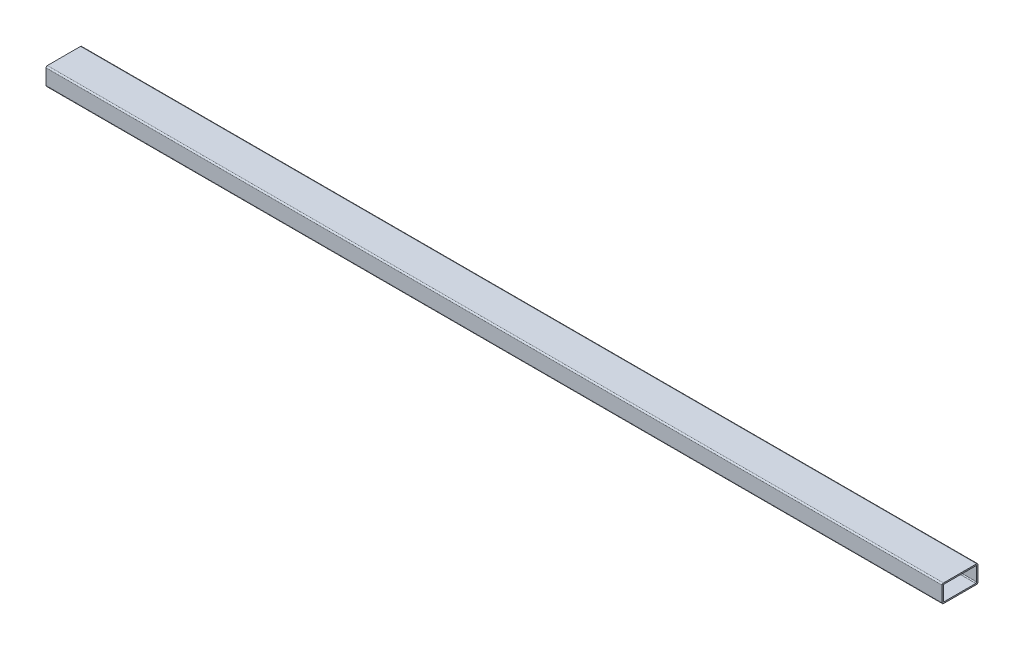
ISO-10303-21;
HEADER;
FILE_DESCRIPTION(('STEP AP214'),'2;1');
FILE_NAME('part.step','',(''),(''),'','','');
FILE_SCHEMA(('AUTOMOTIVE_DESIGN { 1 0 10303 214 1 1 1 1 }'));
ENDSEC;
DATA;
#1=APPLICATION_CONTEXT('core data for automotive mechanical design processes');
#2=APPLICATION_PROTOCOL_DEFINITION('international standard','automotive_design',2000,#1);
#3=PRODUCT_CONTEXT('',#1,'mechanical');
#4=PRODUCT('Part','Part','',(#3));
#5=PRODUCT_RELATED_PRODUCT_CATEGORY('part','',(#4));
#6=PRODUCT_DEFINITION_FORMATION('','',#4);
#7=PRODUCT_DEFINITION_CONTEXT('part definition',#1,'design');
#8=PRODUCT_DEFINITION('design','',#6,#7);
#9=PRODUCT_DEFINITION_SHAPE('','',#8);
#10=(LENGTH_UNIT() NAMED_UNIT(*) SI_UNIT(.MILLI.,.METRE.));
#11=(NAMED_UNIT(*) PLANE_ANGLE_UNIT() SI_UNIT($,.RADIAN.));
#12=(NAMED_UNIT(*) SI_UNIT($,.STERADIAN.) SOLID_ANGLE_UNIT());
#13=UNCERTAINTY_MEASURE_WITH_UNIT(LENGTH_MEASURE(1.E-05),#10,'distance_accuracy_value','');
#14=(GEOMETRIC_REPRESENTATION_CONTEXT(3) GLOBAL_UNCERTAINTY_ASSIGNED_CONTEXT((#13)) GLOBAL_UNIT_ASSIGNED_CONTEXT((#10,
#11,#12)) REPRESENTATION_CONTEXT('',''));
#15=CARTESIAN_POINT('',(0.,0.,0.));
#16=DIRECTION('',(0.,0.,1.));
#17=DIRECTION('',(1.,0.,0.));
#18=AXIS2_PLACEMENT_3D('',#15,#16,#17);
#19=CARTESIAN_POINT('',(-1000.,1.50000000000001,1.49999999999225));
#20=DIRECTION('',(1.,0.,0.));
#21=DIRECTION('',(0.,0.,-1.));
#22=AXIS2_PLACEMENT_3D('',#19,#20,#21);
#23=CYLINDRICAL_SURFACE('',#22,1.5);
#24=CARTESIAN_POINT('',(0.,1.50000000000001,1.49999999999225));
#25=DIRECTION('',(1.,0.,0.));
#26=DIRECTION('',(0.,0.,1.));
#27=AXIS2_PLACEMENT_3D('',#24,#25,#26);
#28=CIRCLE('',#27,1.5);
#29=CARTESIAN_POINT('',(0.,0.,1.49999999999225));
#30=VERTEX_POINT('',#29);
#31=CARTESIAN_POINT('',(0.,1.50000000000003,-7.75768338456828E-12));
#32=VERTEX_POINT('',#31);
#33=EDGE_CURVE('E205',#30,#32,#28,.T.);
#34=ORIENTED_EDGE('',*,*,#33,.F.);
#35=DIRECTION('',(1.,0.,0.));
#36=VECTOR('',#35,1.);
#37=CARTESIAN_POINT('',(-1000.,0.,1.49999999999225));
#38=LINE('',#37,#36);
#39=CARTESIAN_POINT('',(-1000.,0.,1.49999999999225));
#40=VERTEX_POINT('',#39);
#41=EDGE_CURVE('E11',#40,#30,#38,.T.);
#42=ORIENTED_EDGE('',*,*,#41,.F.);
#43=CARTESIAN_POINT('',(-1000.,1.50000000000001,1.49999999999225));
#44=DIRECTION('',(1.,0.,0.));
#45=DIRECTION('',(0.,0.,1.));
#46=AXIS2_PLACEMENT_3D('',#43,#44,#45);
#47=CIRCLE('',#46,1.5);
#48=CARTESIAN_POINT('',(-1000.,1.50000000000003,-7.75768338456828E-12));
#49=VERTEX_POINT('',#48);
#50=EDGE_CURVE('E217',#40,#49,#47,.T.);
#51=ORIENTED_EDGE('',*,*,#50,.T.);
#52=DIRECTION('',(1.,0.,0.));
#53=VECTOR('',#52,1.);
#54=CARTESIAN_POINT('',(-1000.,1.50000000000003,-7.75768338456828E-12));
#55=LINE('',#54,#53);
#56=EDGE_CURVE('E38',#49,#32,#55,.T.);
#57=ORIENTED_EDGE('',*,*,#56,.T.);
#58=EDGE_LOOP('',(#34,#42,#51,#57));
#59=FACE_BOUND('',#58,.T.);
#60=ADVANCED_FACE('F35',(#59),#23,.T.);
#61=CARTESIAN_POINT('',(-1000.,0.,1.49999999999225));
#62=DIRECTION('',(0.,-1.,0.));
#63=DIRECTION('',(0.,0.,-1.));
#64=AXIS2_PLACEMENT_3D('',#61,#62,#63);
#65=PLANE('',#64);
#66=DIRECTION('',(0.,0.,-1.));
#67=VECTOR('',#66,1.);
#68=CARTESIAN_POINT('',(0.,0.,1.49999999999225));
#69=LINE('',#68,#67);
#70=CARTESIAN_POINT('',(0.,0.,38.4999999999922));
#71=VERTEX_POINT('',#70);
#72=EDGE_CURVE('E221',#71,#30,#69,.T.);
#73=ORIENTED_EDGE('',*,*,#72,.F.);
#74=DIRECTION('',(1.,0.,0.));
#75=VECTOR('',#74,1.);
#76=CARTESIAN_POINT('',(-1000.,0.,38.4999999999922));
#77=LINE('',#76,#75);
#78=CARTESIAN_POINT('',(-1000.,0.,38.4999999999922));
#79=VERTEX_POINT('',#78);
#80=EDGE_CURVE('E43',#79,#71,#77,.T.);
#81=ORIENTED_EDGE('',*,*,#80,.F.);
#82=DIRECTION('',(0.,0.,-1.));
#83=VECTOR('',#82,1.);
#84=CARTESIAN_POINT('',(-1000.,0.,1.49999999999225));
#85=LINE('',#84,#83);
#86=EDGE_CURVE('E239',#79,#40,#85,.T.);
#87=ORIENTED_EDGE('',*,*,#86,.T.);
#88=ORIENTED_EDGE('',*,*,#41,.T.);
#89=EDGE_LOOP('',(#73,#81,#87,#88));
#90=FACE_BOUND('',#89,.T.);
#91=ADVANCED_FACE('F286',(#90),#65,.T.);
#92=CARTESIAN_POINT('',(-1000.,1.50000000000001,38.4999999999922));
#93=DIRECTION('',(1.,0.,0.));
#94=DIRECTION('',(0.,0.,-1.));
#95=AXIS2_PLACEMENT_3D('',#92,#93,#94);
#96=CYLINDRICAL_SURFACE('',#95,1.5);
#97=CARTESIAN_POINT('',(0.,1.50000000000001,38.4999999999922));
#98=DIRECTION('',(1.,0.,0.));
#99=DIRECTION('',(0.,0.,1.));
#100=AXIS2_PLACEMENT_3D('',#97,#98,#99);
#101=CIRCLE('',#100,1.5);
#102=CARTESIAN_POINT('',(0.,1.50000000000003,39.9999999999922));
#103=VERTEX_POINT('',#102);
#104=EDGE_CURVE('E259',#103,#71,#101,.T.);
#105=ORIENTED_EDGE('',*,*,#104,.F.);
#106=DIRECTION('',(1.,0.,0.));
#107=VECTOR('',#106,1.);
#108=CARTESIAN_POINT('',(-1000.,1.50000000000003,39.9999999999922));
#109=LINE('',#108,#107);
#110=CARTESIAN_POINT('',(-1000.,1.50000000000003,39.9999999999922));
#111=VERTEX_POINT('',#110);
#112=EDGE_CURVE('E265',#111,#103,#109,.T.);
#113=ORIENTED_EDGE('',*,*,#112,.F.);
#114=CARTESIAN_POINT('',(-1000.,1.50000000000001,38.4999999999922));
#115=DIRECTION('',(1.,0.,0.));
#116=DIRECTION('',(0.,0.,1.));
#117=AXIS2_PLACEMENT_3D('',#114,#115,#116);
#118=CIRCLE('',#117,1.5);
#119=EDGE_CURVE('E236',#111,#79,#118,.T.);
#120=ORIENTED_EDGE('',*,*,#119,.T.);
#121=ORIENTED_EDGE('',*,*,#80,.T.);
#122=EDGE_LOOP('',(#105,#113,#120,#121));
#123=FACE_BOUND('',#122,.T.);
#124=ADVANCED_FACE('F305',(#123),#96,.T.);
#125=CARTESIAN_POINT('',(-1000.,18.5,39.9999999999922));
#126=DIRECTION('',(0.,0.,1.));
#127=DIRECTION('',(1.,0.,0.));
#128=AXIS2_PLACEMENT_3D('',#125,#126,#127);
#129=PLANE('',#128);
#130=DIRECTION('',(0.,-1.,0.));
#131=VECTOR('',#130,1.);
#132=CARTESIAN_POINT('',(0.,18.5,39.9999999999922));
#133=LINE('',#132,#131);
#134=CARTESIAN_POINT('',(0.,18.5,39.9999999999922));
#135=VERTEX_POINT('',#134);
#136=EDGE_CURVE('E256',#135,#103,#133,.T.);
#137=ORIENTED_EDGE('',*,*,#136,.F.);
#138=DIRECTION('',(1.,0.,0.));
#139=VECTOR('',#138,1.);
#140=CARTESIAN_POINT('',(-1000.,18.5,39.9999999999922));
#141=LINE('',#140,#139);
#142=CARTESIAN_POINT('',(-1000.,18.5,39.9999999999922));
#143=VERTEX_POINT('',#142);
#144=EDGE_CURVE('E267',#143,#135,#141,.T.);
#145=ORIENTED_EDGE('',*,*,#144,.F.);
#146=DIRECTION('',(0.,-1.,0.));
#147=VECTOR('',#146,1.);
#148=CARTESIAN_POINT('',(-1000.,18.5,39.9999999999922));
#149=LINE('',#148,#147);
#150=EDGE_CURVE('E233',#143,#111,#149,.T.);
#151=ORIENTED_EDGE('',*,*,#150,.T.);
#152=ORIENTED_EDGE('',*,*,#112,.T.);
#153=EDGE_LOOP('',(#137,#145,#151,#152));
#154=FACE_BOUND('',#153,.T.);
#155=ADVANCED_FACE('F303',(#154),#129,.T.);
#156=CARTESIAN_POINT('',(-1000.,18.5,38.4999999999922));
#157=DIRECTION('',(1.,0.,0.));
#158=DIRECTION('',(0.,0.,-1.));
#159=AXIS2_PLACEMENT_3D('',#156,#157,#158);
#160=CYLINDRICAL_SURFACE('',#159,1.5);
#161=CARTESIAN_POINT('',(0.,18.5,38.4999999999922));
#162=DIRECTION('',(1.,0.,0.));
#163=DIRECTION('',(0.,0.,-1.));
#164=AXIS2_PLACEMENT_3D('',#161,#162,#163);
#165=CIRCLE('',#164,1.5);
#166=CARTESIAN_POINT('',(0.,20.,38.4999999999922));
#167=VERTEX_POINT('',#166);
#168=EDGE_CURVE('E253',#167,#135,#165,.T.);
#169=ORIENTED_EDGE('',*,*,#168,.F.);
#170=DIRECTION('',(1.,0.,0.));
#171=VECTOR('',#170,1.);
#172=CARTESIAN_POINT('',(-1000.,20.,38.4999999999922));
#173=LINE('',#172,#171);
#174=CARTESIAN_POINT('',(-1000.,20.,38.4999999999922));
#175=VERTEX_POINT('',#174);
#176=EDGE_CURVE('E269',#175,#167,#173,.T.);
#177=ORIENTED_EDGE('',*,*,#176,.F.);
#178=CARTESIAN_POINT('',(-1000.,18.5,38.4999999999922));
#179=DIRECTION('',(1.,0.,0.));
#180=DIRECTION('',(0.,0.,-1.));
#181=AXIS2_PLACEMENT_3D('',#178,#179,#180);
#182=CIRCLE('',#181,1.5);
#183=EDGE_CURVE('E230',#175,#143,#182,.T.);
#184=ORIENTED_EDGE('',*,*,#183,.T.);
#185=ORIENTED_EDGE('',*,*,#144,.T.);
#186=EDGE_LOOP('',(#169,#177,#184,#185));
#187=FACE_BOUND('',#186,.T.);
#188=ADVANCED_FACE('F299',(#187),#160,.T.);
#189=CARTESIAN_POINT('',(-1000.,20.,1.49999999999225));
#190=DIRECTION('',(0.,1.,0.));
#191=DIRECTION('',(0.,0.,1.));
#192=AXIS2_PLACEMENT_3D('',#189,#190,#191);
#193=PLANE('',#192);
#194=DIRECTION('',(0.,0.,1.));
#195=VECTOR('',#194,1.);
#196=CARTESIAN_POINT('',(0.,20.,1.49999999999225));
#197=LINE('',#196,#195);
#198=CARTESIAN_POINT('',(0.,20.,1.49999999999225));
#199=VERTEX_POINT('',#198);
#200=EDGE_CURVE('E250',#199,#167,#197,.T.);
#201=ORIENTED_EDGE('',*,*,#200,.F.);
#202=DIRECTION('',(1.,0.,0.));
#203=VECTOR('',#202,1.);
#204=CARTESIAN_POINT('',(-1000.,20.,1.49999999999225));
#205=LINE('',#204,#203);
#206=CARTESIAN_POINT('',(-1000.,20.,1.49999999999225));
#207=VERTEX_POINT('',#206);
#208=EDGE_CURVE('E271',#207,#199,#205,.T.);
#209=ORIENTED_EDGE('',*,*,#208,.F.);
#210=DIRECTION('',(0.,0.,1.));
#211=VECTOR('',#210,1.);
#212=CARTESIAN_POINT('',(-1000.,20.,1.49999999999225));
#213=LINE('',#212,#211);
#214=EDGE_CURVE('E227',#207,#175,#213,.T.);
#215=ORIENTED_EDGE('',*,*,#214,.T.);
#216=ORIENTED_EDGE('',*,*,#176,.T.);
#217=EDGE_LOOP('',(#201,#209,#215,#216));
#218=FACE_BOUND('',#217,.T.);
#219=ADVANCED_FACE('F297',(#218),#193,.T.);
#220=CARTESIAN_POINT('',(-1000.,18.5,1.49999999999225));
#221=DIRECTION('',(1.,0.,0.));
#222=DIRECTION('',(0.,0.,-1.));
#223=AXIS2_PLACEMENT_3D('',#220,#221,#222);
#224=CYLINDRICAL_SURFACE('',#223,1.50000000000001);
#225=CARTESIAN_POINT('',(0.,18.5,1.49999999999225));
#226=DIRECTION('',(1.,0.,0.));
#227=DIRECTION('',(0.,0.,1.));
#228=AXIS2_PLACEMENT_3D('',#225,#226,#227);
#229=CIRCLE('',#228,1.50000000000001);
#230=CARTESIAN_POINT('',(0.,18.5,-7.75768338456828E-12));
#231=VERTEX_POINT('',#230);
#232=EDGE_CURVE('E247',#231,#199,#229,.T.);
#233=ORIENTED_EDGE('',*,*,#232,.F.);
#234=DIRECTION('',(1.,0.,0.));
#235=VECTOR('',#234,1.);
#236=CARTESIAN_POINT('',(-1000.,18.5,-7.75768338456828E-12));
#237=LINE('',#236,#235);
#238=CARTESIAN_POINT('',(-1000.,18.5,-7.75768338456828E-12));
#239=VERTEX_POINT('',#238);
#240=EDGE_CURVE('E272',#239,#231,#237,.T.);
#241=ORIENTED_EDGE('',*,*,#240,.F.);
#242=CARTESIAN_POINT('',(-1000.,18.5,1.49999999999225));
#243=DIRECTION('',(1.,0.,0.));
#244=DIRECTION('',(0.,0.,1.));
#245=AXIS2_PLACEMENT_3D('',#242,#243,#244);
#246=CIRCLE('',#245,1.50000000000001);
#247=EDGE_CURVE('E224',#239,#207,#246,.T.);
#248=ORIENTED_EDGE('',*,*,#247,.T.);
#249=ORIENTED_EDGE('',*,*,#208,.T.);
#250=EDGE_LOOP('',(#233,#241,#248,#249));
#251=FACE_BOUND('',#250,.T.);
#252=ADVANCED_FACE('F293',(#251),#224,.T.);
#253=CARTESIAN_POINT('',(-1000.,18.5,-7.75768338456828E-12));
#254=DIRECTION('',(0.,0.,-1.));
#255=DIRECTION('',(-1.,0.,0.));
#256=AXIS2_PLACEMENT_3D('',#253,#254,#255);
#257=PLANE('',#256);
#258=DIRECTION('',(0.,1.,0.));
#259=VECTOR('',#258,1.);
#260=CARTESIAN_POINT('',(0.,18.5,-7.75768338456828E-12));
#261=LINE('',#260,#259);
#262=EDGE_CURVE('E244',#32,#231,#261,.T.);
#263=ORIENTED_EDGE('',*,*,#262,.F.);
#264=ORIENTED_EDGE('',*,*,#56,.F.);
#265=DIRECTION('',(0.,1.,0.));
#266=VECTOR('',#265,1.);
#267=CARTESIAN_POINT('',(-1000.,18.5,-7.75768338456828E-12));
#268=LINE('',#267,#266);
#269=EDGE_CURVE('E220',#49,#239,#268,.T.);
#270=ORIENTED_EDGE('',*,*,#269,.T.);
#271=ORIENTED_EDGE('',*,*,#240,.T.);
#272=EDGE_LOOP('',(#263,#264,#270,#271));
#273=FACE_BOUND('',#272,.T.);
#274=ADVANCED_FACE('F280',(#273),#257,.T.);
#275=CARTESIAN_POINT('',(-1000.,1.50000000000001,1.49999999999225));
#276=DIRECTION('',(-1.,0.,0.));
#277=DIRECTION('',(0.,0.,1.));
#278=AXIS2_PLACEMENT_3D('',#275,#276,#277);
#279=PLANE('',#278);
#280=CARTESIAN_POINT('',(-1000.,2.50000000000001,37.4999999999922));
#281=DIRECTION('',(1.,0.,0.));
#282=DIRECTION('',(0.,0.,1.));
#283=AXIS2_PLACEMENT_3D('',#280,#281,#282);
#284=CIRCLE('',#283,0.999999999999994);
#285=CARTESIAN_POINT('',(-1000.,2.50000000000001,38.4999999999922));
#286=VERTEX_POINT('',#285);
#287=CARTESIAN_POINT('',(-1000.,1.50000000000001,37.4999999999922));
#288=VERTEX_POINT('',#287);
#289=EDGE_CURVE('E150',#286,#288,#284,.T.);
#290=ORIENTED_EDGE('',*,*,#289,.T.);
#291=DIRECTION('',(0.,0.,-1.));
#292=VECTOR('',#291,1.);
#293=CARTESIAN_POINT('',(-1000.,1.50000000000001,2.49999999999225));
#294=LINE('',#293,#292);
#295=CARTESIAN_POINT('',(-1000.,1.50000000000001,2.49999999999225));
#296=VERTEX_POINT('',#295);
#297=EDGE_CURVE('E159',#288,#296,#294,.T.);
#298=ORIENTED_EDGE('',*,*,#297,.T.);
#299=CARTESIAN_POINT('',(-1000.,2.50000000000001,2.49999999999225));
#300=DIRECTION('',(1.,0.,0.));
#301=DIRECTION('',(0.,0.,1.));
#302=AXIS2_PLACEMENT_3D('',#299,#300,#301);
#303=CIRCLE('',#302,1.);
#304=CARTESIAN_POINT('',(-1000.,2.50000000000001,1.49999999999225));
#305=VERTEX_POINT('',#304);
#306=EDGE_CURVE('E51',#296,#305,#303,.T.);
#307=ORIENTED_EDGE('',*,*,#306,.T.);
#308=DIRECTION('',(0.,1.,0.));
#309=VECTOR('',#308,1.);
#310=CARTESIAN_POINT('',(-1000.,17.5,1.49999999999225));
#311=LINE('',#310,#309);
#312=CARTESIAN_POINT('',(-1000.,17.5,1.49999999999225));
#313=VERTEX_POINT('',#312);
#314=EDGE_CURVE('E174',#305,#313,#311,.T.);
#315=ORIENTED_EDGE('',*,*,#314,.T.);
#316=CARTESIAN_POINT('',(-1000.,17.5,2.49999999999225));
#317=DIRECTION('',(1.,0.,0.));
#318=DIRECTION('',(0.,0.,1.));
#319=AXIS2_PLACEMENT_3D('',#316,#317,#318);
#320=CIRCLE('',#319,1.);
#321=CARTESIAN_POINT('',(-1000.,18.5,2.49999999999225));
#322=VERTEX_POINT('',#321);
#323=EDGE_CURVE('E177',#313,#322,#320,.T.);
#324=ORIENTED_EDGE('',*,*,#323,.T.);
#325=DIRECTION('',(0.,0.,1.));
#326=VECTOR('',#325,1.);
#327=CARTESIAN_POINT('',(-1000.,18.5,2.49999999999225));
#328=LINE('',#327,#326);
#329=CARTESIAN_POINT('',(-1000.,18.5,37.4999999999922));
#330=VERTEX_POINT('',#329);
#331=EDGE_CURVE('E180',#322,#330,#328,.T.);
#332=ORIENTED_EDGE('',*,*,#331,.T.);
#333=CARTESIAN_POINT('',(-1000.,17.5,37.4999999999922));
#334=DIRECTION('',(1.,0.,0.));
#335=DIRECTION('',(0.,0.,-1.));
#336=AXIS2_PLACEMENT_3D('',#333,#334,#335);
#337=CIRCLE('',#336,0.999999999999997);
#338=CARTESIAN_POINT('',(-1000.,17.5,38.4999999999922));
#339=VERTEX_POINT('',#338);
#340=EDGE_CURVE('E183',#330,#339,#337,.T.);
#341=ORIENTED_EDGE('',*,*,#340,.T.);
#342=DIRECTION('',(0.,-1.,0.));
#343=VECTOR('',#342,1.);
#344=CARTESIAN_POINT('',(-1000.,17.5,38.4999999999922));
#345=LINE('',#344,#343);
#346=EDGE_CURVE('E156',#339,#286,#345,.T.);
#347=ORIENTED_EDGE('',*,*,#346,.T.);
#348=EDGE_LOOP('',(#290,#298,#307,#315,#324,#332,#341,#347));
#349=FACE_BOUND('',#348,.T.);
#350=ORIENTED_EDGE('',*,*,#50,.F.);
#351=ORIENTED_EDGE('',*,*,#86,.F.);
#352=ORIENTED_EDGE('',*,*,#119,.F.);
#353=ORIENTED_EDGE('',*,*,#150,.F.);
#354=ORIENTED_EDGE('',*,*,#183,.F.);
#355=ORIENTED_EDGE('',*,*,#214,.F.);
#356=ORIENTED_EDGE('',*,*,#247,.F.);
#357=ORIENTED_EDGE('',*,*,#269,.F.);
#358=EDGE_LOOP('',(#350,#351,#352,#353,#354,#355,#356,#357));
#359=FACE_BOUND('',#358,.T.);
#360=ADVANCED_FACE('F163',(#349,#359),#279,.T.);
#361=CARTESIAN_POINT('',(0.,1.50000000000001,1.49999999999225));
#362=DIRECTION('',(-1.,0.,0.));
#363=DIRECTION('',(0.,0.,1.));
#364=AXIS2_PLACEMENT_3D('',#361,#362,#363);
#365=PLANE('',#364);
#366=DIRECTION('',(0.,0.,-1.));
#367=VECTOR('',#366,1.);
#368=CARTESIAN_POINT('',(0.,1.50000000000001,2.49999999999225));
#369=LINE('',#368,#367);
#370=CARTESIAN_POINT('',(0.,1.50000000000001,37.4999999999922));
#371=VERTEX_POINT('',#370);
#372=CARTESIAN_POINT('',(0.,1.50000000000001,2.49999999999225));
#373=VERTEX_POINT('',#372);
#374=EDGE_CURVE('E187',#371,#373,#369,.T.);
#375=ORIENTED_EDGE('',*,*,#374,.F.);
#376=CARTESIAN_POINT('',(0.,2.50000000000001,37.4999999999922));
#377=DIRECTION('',(1.,0.,0.));
#378=DIRECTION('',(0.,0.,1.));
#379=AXIS2_PLACEMENT_3D('',#376,#377,#378);
#380=CIRCLE('',#379,0.999999999999994);
#381=CARTESIAN_POINT('',(0.,2.50000000000001,38.4999999999922));
#382=VERTEX_POINT('',#381);
#383=EDGE_CURVE('E59',#382,#371,#380,.T.);
#384=ORIENTED_EDGE('',*,*,#383,.F.);
#385=DIRECTION('',(0.,-1.,0.));
#386=VECTOR('',#385,1.);
#387=CARTESIAN_POINT('',(0.,17.5,38.4999999999922));
#388=LINE('',#387,#386);
#389=CARTESIAN_POINT('',(0.,17.5,38.4999999999922));
#390=VERTEX_POINT('',#389);
#391=EDGE_CURVE('E167',#390,#382,#388,.T.);
#392=ORIENTED_EDGE('',*,*,#391,.F.);
#393=CARTESIAN_POINT('',(0.,17.5,37.4999999999922));
#394=DIRECTION('',(1.,0.,0.));
#395=DIRECTION('',(0.,0.,-1.));
#396=AXIS2_PLACEMENT_3D('',#393,#394,#395);
#397=CIRCLE('',#396,0.999999999999997);
#398=CARTESIAN_POINT('',(0.,18.5,37.4999999999922));
#399=VERTEX_POINT('',#398);
#400=EDGE_CURVE('E170',#399,#390,#397,.T.);
#401=ORIENTED_EDGE('',*,*,#400,.F.);
#402=DIRECTION('',(0.,0.,1.));
#403=VECTOR('',#402,1.);
#404=CARTESIAN_POINT('',(0.,18.5,2.49999999999225));
#405=LINE('',#404,#403);
#406=CARTESIAN_POINT('',(0.,18.5,2.49999999999225));
#407=VERTEX_POINT('',#406);
#408=EDGE_CURVE('E198',#407,#399,#405,.T.);
#409=ORIENTED_EDGE('',*,*,#408,.F.);
#410=CARTESIAN_POINT('',(0.,17.5,2.49999999999225));
#411=DIRECTION('',(1.,0.,0.));
#412=DIRECTION('',(0.,0.,1.));
#413=AXIS2_PLACEMENT_3D('',#410,#411,#412);
#414=CIRCLE('',#413,1.);
#415=CARTESIAN_POINT('',(0.,17.5,1.49999999999225));
#416=VERTEX_POINT('',#415);
#417=EDGE_CURVE('E195',#416,#407,#414,.T.);
#418=ORIENTED_EDGE('',*,*,#417,.F.);
#419=DIRECTION('',(0.,1.,0.));
#420=VECTOR('',#419,1.);
#421=CARTESIAN_POINT('',(0.,17.5,1.49999999999225));
#422=LINE('',#421,#420);
#423=CARTESIAN_POINT('',(0.,2.50000000000001,1.49999999999225));
#424=VERTEX_POINT('',#423);
#425=EDGE_CURVE('E192',#424,#416,#422,.T.);
#426=ORIENTED_EDGE('',*,*,#425,.F.);
#427=CARTESIAN_POINT('',(0.,2.50000000000001,2.49999999999225));
#428=DIRECTION('',(1.,0.,0.));
#429=DIRECTION('',(0.,0.,1.));
#430=AXIS2_PLACEMENT_3D('',#427,#428,#429);
#431=CIRCLE('',#430,1.);
#432=EDGE_CURVE('E189',#373,#424,#431,.T.);
#433=ORIENTED_EDGE('',*,*,#432,.F.);
#434=EDGE_LOOP('',(#375,#384,#392,#401,#409,#418,#426,#433));
#435=FACE_BOUND('',#434,.T.);
#436=ORIENTED_EDGE('',*,*,#33,.T.);
#437=ORIENTED_EDGE('',*,*,#262,.T.);
#438=ORIENTED_EDGE('',*,*,#232,.T.);
#439=ORIENTED_EDGE('',*,*,#200,.T.);
#440=ORIENTED_EDGE('',*,*,#168,.T.);
#441=ORIENTED_EDGE('',*,*,#136,.T.);
#442=ORIENTED_EDGE('',*,*,#104,.T.);
#443=ORIENTED_EDGE('',*,*,#72,.T.);
#444=EDGE_LOOP('',(#436,#437,#438,#439,#440,#441,#442,#443));
#445=FACE_BOUND('',#444,.T.);
#446=ADVANCED_FACE('F282',(#435,#445),#365,.F.);
#447=CARTESIAN_POINT('',(-1000.,2.50000000000001,37.4999999999922));
#448=DIRECTION('',(1.,0.,0.));
#449=DIRECTION('',(0.,0.,-1.));
#450=AXIS2_PLACEMENT_3D('',#447,#448,#449);
#451=CYLINDRICAL_SURFACE('',#450,0.999999999999994);
#452=ORIENTED_EDGE('',*,*,#383,.T.);
#453=DIRECTION('',(1.,0.,0.));
#454=VECTOR('',#453,1.);
#455=CARTESIAN_POINT('',(-1000.,1.50000000000001,37.4999999999922));
#456=LINE('',#455,#454);
#457=EDGE_CURVE('E146',#288,#371,#456,.T.);
#458=ORIENTED_EDGE('',*,*,#457,.F.);
#459=ORIENTED_EDGE('',*,*,#289,.F.);
#460=DIRECTION('',(1.,0.,0.));
#461=VECTOR('',#460,1.);
#462=CARTESIAN_POINT('',(-1000.,2.50000000000001,38.4999999999922));
#463=LINE('',#462,#461);
#464=EDGE_CURVE('E203',#286,#382,#463,.T.);
#465=ORIENTED_EDGE('',*,*,#464,.T.);
#466=EDGE_LOOP('',(#452,#458,#459,#465));
#467=FACE_BOUND('',#466,.T.);
#468=ADVANCED_FACE('F148',(#467),#451,.F.);
#469=CARTESIAN_POINT('',(-1000.,17.5,38.4999999999922));
#470=DIRECTION('',(0.,0.,1.));
#471=DIRECTION('',(0.,-1.,0.));
#472=AXIS2_PLACEMENT_3D('',#469,#470,#471);
#473=PLANE('',#472);
#474=ORIENTED_EDGE('',*,*,#391,.T.);
#475=ORIENTED_EDGE('',*,*,#464,.F.);
#476=ORIENTED_EDGE('',*,*,#346,.F.);
#477=DIRECTION('',(1.,0.,0.));
#478=VECTOR('',#477,1.);
#479=CARTESIAN_POINT('',(-1000.,17.5,38.4999999999922));
#480=LINE('',#479,#478);
#481=EDGE_CURVE('E206',#339,#390,#480,.T.);
#482=ORIENTED_EDGE('',*,*,#481,.T.);
#483=EDGE_LOOP('',(#474,#475,#476,#482));
#484=FACE_BOUND('',#483,.T.);
#485=ADVANCED_FACE('F388',(#484),#473,.F.);
#486=CARTESIAN_POINT('',(-1000.,17.5,37.4999999999922));
#487=DIRECTION('',(1.,0.,0.));
#488=DIRECTION('',(0.,0.,-1.));
#489=AXIS2_PLACEMENT_3D('',#486,#487,#488);
#490=CYLINDRICAL_SURFACE('',#489,0.999999999999997);
#491=ORIENTED_EDGE('',*,*,#400,.T.);
#492=ORIENTED_EDGE('',*,*,#481,.F.);
#493=ORIENTED_EDGE('',*,*,#340,.F.);
#494=DIRECTION('',(1.,0.,0.));
#495=VECTOR('',#494,1.);
#496=CARTESIAN_POINT('',(-1000.,18.5,37.4999999999922));
#497=LINE('',#496,#495);
#498=EDGE_CURVE('E208',#330,#399,#497,.T.);
#499=ORIENTED_EDGE('',*,*,#498,.T.);
#500=EDGE_LOOP('',(#491,#492,#493,#499));
#501=FACE_BOUND('',#500,.T.);
#502=ADVANCED_FACE('F397',(#501),#490,.F.);
#503=CARTESIAN_POINT('',(-1000.,18.5,2.49999999999225));
#504=DIRECTION('',(0.,1.,0.));
#505=DIRECTION('',(0.,0.,1.));
#506=AXIS2_PLACEMENT_3D('',#503,#504,#505);
#507=PLANE('',#506);
#508=ORIENTED_EDGE('',*,*,#408,.T.);
#509=ORIENTED_EDGE('',*,*,#498,.F.);
#510=ORIENTED_EDGE('',*,*,#331,.F.);
#511=DIRECTION('',(1.,0.,0.));
#512=VECTOR('',#511,1.);
#513=CARTESIAN_POINT('',(-1000.,18.5,2.49999999999225));
#514=LINE('',#513,#512);
#515=EDGE_CURVE('E210',#322,#407,#514,.T.);
#516=ORIENTED_EDGE('',*,*,#515,.T.);
#517=EDGE_LOOP('',(#508,#509,#510,#516));
#518=FACE_BOUND('',#517,.T.);
#519=ADVANCED_FACE('F407',(#518),#507,.F.);
#520=CARTESIAN_POINT('',(-1000.,17.5,2.49999999999225));
#521=DIRECTION('',(1.,0.,0.));
#522=DIRECTION('',(0.,0.,-1.));
#523=AXIS2_PLACEMENT_3D('',#520,#521,#522);
#524=CYLINDRICAL_SURFACE('',#523,1.);
#525=ORIENTED_EDGE('',*,*,#417,.T.);
#526=ORIENTED_EDGE('',*,*,#515,.F.);
#527=ORIENTED_EDGE('',*,*,#323,.F.);
#528=DIRECTION('',(1.,0.,0.));
#529=VECTOR('',#528,1.);
#530=CARTESIAN_POINT('',(-1000.,17.5,1.49999999999225));
#531=LINE('',#530,#529);
#532=EDGE_CURVE('E212',#313,#416,#531,.T.);
#533=ORIENTED_EDGE('',*,*,#532,.T.);
#534=EDGE_LOOP('',(#525,#526,#527,#533));
#535=FACE_BOUND('',#534,.T.);
#536=ADVANCED_FACE('F417',(#535),#524,.F.);
#537=CARTESIAN_POINT('',(-1000.,17.5,1.49999999999225));
#538=DIRECTION('',(0.,0.,-1.));
#539=DIRECTION('',(0.,1.,0.));
#540=AXIS2_PLACEMENT_3D('',#537,#538,#539);
#541=PLANE('',#540);
#542=ORIENTED_EDGE('',*,*,#425,.T.);
#543=ORIENTED_EDGE('',*,*,#532,.F.);
#544=ORIENTED_EDGE('',*,*,#314,.F.);
#545=DIRECTION('',(1.,0.,0.));
#546=VECTOR('',#545,1.);
#547=CARTESIAN_POINT('',(-1000.,2.50000000000001,1.49999999999225));
#548=LINE('',#547,#546);
#549=EDGE_CURVE('E214',#305,#424,#548,.T.);
#550=ORIENTED_EDGE('',*,*,#549,.T.);
#551=EDGE_LOOP('',(#542,#543,#544,#550));
#552=FACE_BOUND('',#551,.T.);
#553=ADVANCED_FACE('F427',(#552),#541,.F.);
#554=CARTESIAN_POINT('',(-1000.,2.50000000000001,2.49999999999225));
#555=DIRECTION('',(1.,0.,0.));
#556=DIRECTION('',(0.,0.,-1.));
#557=AXIS2_PLACEMENT_3D('',#554,#555,#556);
#558=CYLINDRICAL_SURFACE('',#557,1.);
#559=ORIENTED_EDGE('',*,*,#432,.T.);
#560=ORIENTED_EDGE('',*,*,#549,.F.);
#561=ORIENTED_EDGE('',*,*,#306,.F.);
#562=DIRECTION('',(1.,0.,0.));
#563=VECTOR('',#562,1.);
#564=CARTESIAN_POINT('',(-1000.,1.50000000000001,2.49999999999225));
#565=LINE('',#564,#563);
#566=EDGE_CURVE('E155',#296,#373,#565,.T.);
#567=ORIENTED_EDGE('',*,*,#566,.T.);
#568=EDGE_LOOP('',(#559,#560,#561,#567));
#569=FACE_BOUND('',#568,.T.);
#570=ADVANCED_FACE('F437',(#569),#558,.F.);
#571=CARTESIAN_POINT('',(-1000.,1.50000000000001,2.49999999999225));
#572=DIRECTION('',(0.,-1.,0.));
#573=DIRECTION('',(0.,0.,-1.));
#574=AXIS2_PLACEMENT_3D('',#571,#572,#573);
#575=PLANE('',#574);
#576=ORIENTED_EDGE('',*,*,#374,.T.);
#577=ORIENTED_EDGE('',*,*,#566,.F.);
#578=ORIENTED_EDGE('',*,*,#297,.F.);
#579=ORIENTED_EDGE('',*,*,#457,.T.);
#580=EDGE_LOOP('',(#576,#577,#578,#579));
#581=FACE_BOUND('',#580,.T.);
#582=ADVANCED_FACE('F160',(#581),#575,.F.);
#583=CLOSED_SHELL('',(#60,#91,#124,#155,#188,#219,#252,#274,#360,#446,#468,#485,#502,#519,#536,
#553,#570,#582));
#584=MANIFOLD_SOLID_BREP('B2',#583);
#585=ADVANCED_BREP_SHAPE_REPRESENTATION('',(#18,#584),#14);
#586=SHAPE_DEFINITION_REPRESENTATION(#9,#585);
ENDSEC;
END-ISO-10303-21;
